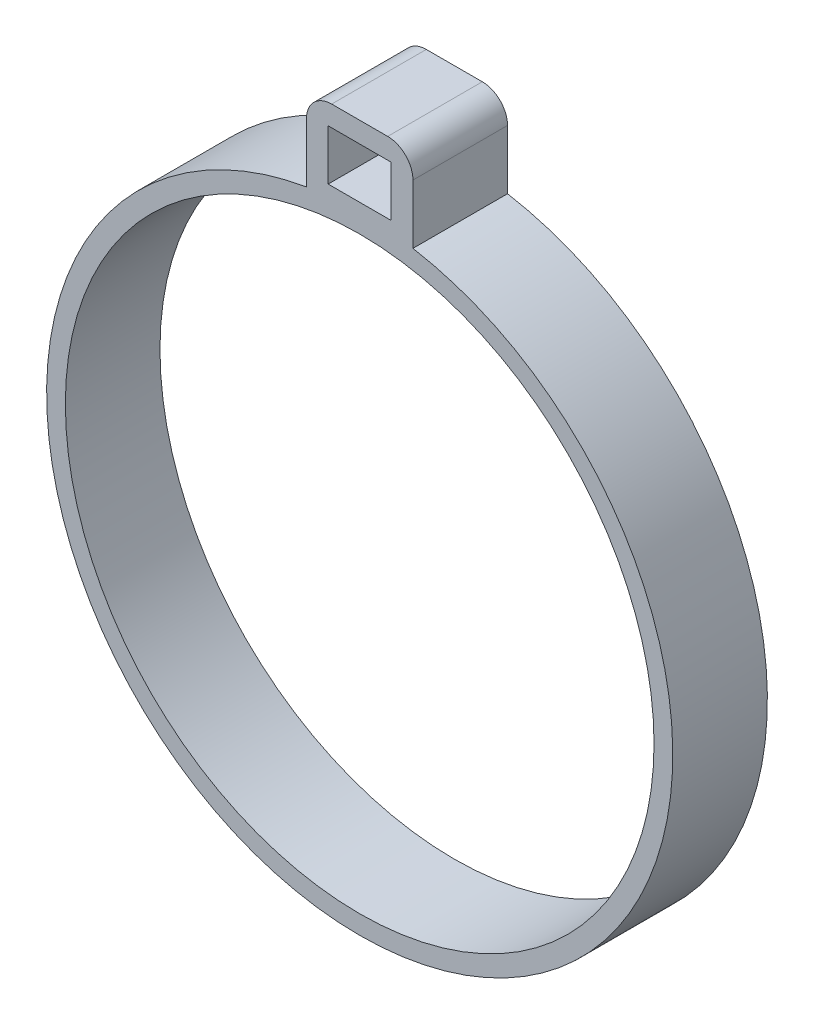
ISO-10303-21;
HEADER;
FILE_DESCRIPTION(('STEP AP214'),'2;1');
FILE_NAME('part.step','',(''),(''),'','','');
FILE_SCHEMA(('AUTOMOTIVE_DESIGN { 1 0 10303 214 1 1 1 1 }'));
ENDSEC;
DATA;
#1=APPLICATION_CONTEXT('core data for automotive mechanical design processes');
#2=APPLICATION_PROTOCOL_DEFINITION('international standard','automotive_design',2000,#1);
#3=PRODUCT_CONTEXT('',#1,'mechanical');
#4=PRODUCT('Part','Part','',(#3));
#5=PRODUCT_RELATED_PRODUCT_CATEGORY('part','',(#4));
#6=PRODUCT_DEFINITION_FORMATION('','',#4);
#7=PRODUCT_DEFINITION_CONTEXT('part definition',#1,'design');
#8=PRODUCT_DEFINITION('design','',#6,#7);
#9=PRODUCT_DEFINITION_SHAPE('','',#8);
#10=(LENGTH_UNIT() NAMED_UNIT(*) SI_UNIT(.MILLI.,.METRE.));
#11=(NAMED_UNIT(*) PLANE_ANGLE_UNIT() SI_UNIT($,.RADIAN.));
#12=(NAMED_UNIT(*) SI_UNIT($,.STERADIAN.) SOLID_ANGLE_UNIT());
#13=UNCERTAINTY_MEASURE_WITH_UNIT(LENGTH_MEASURE(1.E-05),#10,'distance_accuracy_value','');
#14=(GEOMETRIC_REPRESENTATION_CONTEXT(3) GLOBAL_UNCERTAINTY_ASSIGNED_CONTEXT((#13)) GLOBAL_UNIT_ASSIGNED_CONTEXT((#10,
#11,#12)) REPRESENTATION_CONTEXT('',''));
#15=CARTESIAN_POINT('',(0.,0.,0.));
#16=DIRECTION('',(0.,0.,1.));
#17=DIRECTION('',(1.,0.,0.));
#18=AXIS2_PLACEMENT_3D('',#15,#16,#17);
#19=CARTESIAN_POINT('',(0.,0.,7.5));
#20=DIRECTION('',(0.,0.,1.));
#21=DIRECTION('',(1.,0.,0.));
#22=AXIS2_PLACEMENT_3D('',#19,#20,#21);
#23=PLANE('',#22);
#24=DIRECTION('',(1.,0.,0.));
#25=VECTOR('',#24,1.);
#26=CARTESIAN_POINT('',(8.43970978087327,62.2911960228425,7.5));
#27=LINE('',#26,#25);
#28=CARTESIAN_POINT('',(-4.43970978087327,62.2911960228425,7.5));
#29=VERTEX_POINT('',#28);
#30=CARTESIAN_POINT('',(4.43970978087327,62.2911960228425,7.5));
#31=VERTEX_POINT('',#30);
#32=EDGE_CURVE('E155',#29,#31,#27,.T.);
#33=ORIENTED_EDGE('',*,*,#32,.F.);
#34=CARTESIAN_POINT('',(-4.43970978087327,58.2911960228425,7.5));
#35=DIRECTION('',(0.,0.,1.));
#36=DIRECTION('',(1.,0.,0.));
#37=AXIS2_PLACEMENT_3D('',#34,#35,#36);
#38=CIRCLE('',#37,4.);
#39=CARTESIAN_POINT('',(-8.43970978087327,58.2911960228425,7.5));
#40=VERTEX_POINT('',#39);
#41=EDGE_CURVE('E41',#29,#40,#38,.T.);
#42=ORIENTED_EDGE('',*,*,#41,.T.);
#43=DIRECTION('',(0.,1.,0.));
#44=VECTOR('',#43,1.);
#45=CARTESIAN_POINT('',(-8.43970978087327,62.2911960228425,7.5));
#46=LINE('',#45,#44);
#47=CARTESIAN_POINT('',(-8.43970978087327,48.9157528154891,7.5));
#48=VERTEX_POINT('',#47);
#49=EDGE_CURVE('E152',#48,#40,#46,.T.);
#50=ORIENTED_EDGE('',*,*,#49,.F.);
#51=CARTESIAN_POINT('',(0.,0.,7.5));
#52=DIRECTION('',(0.,0.,1.));
#53=DIRECTION('',(1.,0.,0.));
#54=AXIS2_PLACEMENT_3D('',#51,#52,#53);
#55=CIRCLE('',#54,49.6384888437531);
#56=CARTESIAN_POINT('',(8.43970978087327,48.9157528154891,7.5));
#57=VERTEX_POINT('',#56);
#58=EDGE_CURVE('E173',#48,#57,#55,.T.);
#59=ORIENTED_EDGE('',*,*,#58,.T.);
#60=DIRECTION('',(0.,-1.,0.));
#61=VECTOR('',#60,1.);
#62=CARTESIAN_POINT('',(8.43970978087327,62.2911960228425,7.5));
#63=LINE('',#62,#61);
#64=CARTESIAN_POINT('',(8.43970978087327,58.2911960228425,7.5));
#65=VERTEX_POINT('',#64);
#66=EDGE_CURVE('E158',#65,#57,#63,.T.);
#67=ORIENTED_EDGE('',*,*,#66,.F.);
#68=CARTESIAN_POINT('',(4.43970978087327,58.2911960228425,7.5));
#69=DIRECTION('',(0.,0.,1.));
#70=DIRECTION('',(1.,0.,0.));
#71=AXIS2_PLACEMENT_3D('',#68,#69,#70);
#72=CIRCLE('',#71,4.);
#73=EDGE_CURVE('E53',#65,#31,#72,.T.);
#74=ORIENTED_EDGE('',*,*,#73,.T.);
#75=EDGE_LOOP('',(#33,#42,#50,#59,#67,#74));
#76=FACE_BOUND('',#75,.T.);
#77=CARTESIAN_POINT('',(0.,0.,7.5));
#78=DIRECTION('',(0.,0.,1.));
#79=DIRECTION('',(1.,0.,0.));
#80=AXIS2_PLACEMENT_3D('',#77,#78,#79);
#81=CIRCLE('',#80,46.6676642181221);
#82=CARTESIAN_POINT('',(46.6676642181221,0.,7.5));
#83=VERTEX_POINT('',#82);
#84=EDGE_CURVE('E167',#83,#83,#81,.T.);
#85=ORIENTED_EDGE('',*,*,#84,.F.);
#86=EDGE_LOOP('',(#85));
#87=FACE_BOUND('',#86,.T.);
#88=DIRECTION('',(-1.,0.,0.));
#89=VECTOR('',#88,1.);
#90=CARTESIAN_POINT('',(5.,51.0246494821411,7.5));
#91=LINE('',#90,#89);
#92=CARTESIAN_POINT('',(5.,51.0246494821411,7.5));
#93=VERTEX_POINT('',#92);
#94=CARTESIAN_POINT('',(-5.,51.0246494821411,7.5));
#95=VERTEX_POINT('',#94);
#96=EDGE_CURVE('E122',#93,#95,#91,.T.);
#97=ORIENTED_EDGE('',*,*,#96,.T.);
#98=DIRECTION('',(0.,1.,0.));
#99=VECTOR('',#98,1.);
#100=CARTESIAN_POINT('',(-5.,59.0246494821411,7.5));
#101=LINE('',#100,#99);
#102=CARTESIAN_POINT('',(-5.,59.0246494821411,7.5));
#103=VERTEX_POINT('',#102);
#104=EDGE_CURVE('E114',#95,#103,#101,.T.);
#105=ORIENTED_EDGE('',*,*,#104,.T.);
#106=DIRECTION('',(1.,0.,0.));
#107=VECTOR('',#106,1.);
#108=CARTESIAN_POINT('',(5.,59.0246494821411,7.5));
#109=LINE('',#108,#107);
#110=CARTESIAN_POINT('',(5.,59.0246494821411,7.5));
#111=VERTEX_POINT('',#110);
#112=EDGE_CURVE('E126',#103,#111,#109,.T.);
#113=ORIENTED_EDGE('',*,*,#112,.T.);
#114=DIRECTION('',(0.,-1.,0.));
#115=VECTOR('',#114,1.);
#116=CARTESIAN_POINT('',(5.,59.0246494821411,7.5));
#117=LINE('',#116,#115);
#118=EDGE_CURVE('E130',#111,#93,#117,.T.);
#119=ORIENTED_EDGE('',*,*,#118,.T.);
#120=EDGE_LOOP('',(#97,#105,#113,#119));
#121=FACE_BOUND('',#120,.T.);
#122=ADVANCED_FACE('F33',(#76,#87,#121),#23,.T.);
#123=CARTESIAN_POINT('',(0.,0.,-7.5));
#124=DIRECTION('',(0.,0.,1.));
#125=DIRECTION('',(1.,0.,0.));
#126=AXIS2_PLACEMENT_3D('',#123,#124,#125);
#127=PLANE('',#126);
#128=DIRECTION('',(0.,1.,0.));
#129=VECTOR('',#128,1.);
#130=CARTESIAN_POINT('',(-8.43970978087327,62.2911960228425,-7.5));
#131=LINE('',#130,#129);
#132=CARTESIAN_POINT('',(-8.43970978087327,48.9157528154891,-7.5));
#133=VERTEX_POINT('',#132);
#134=CARTESIAN_POINT('',(-8.43970978087327,58.2911960228425,-7.5));
#135=VERTEX_POINT('',#134);
#136=EDGE_CURVE('E148',#133,#135,#131,.T.);
#137=ORIENTED_EDGE('',*,*,#136,.T.);
#138=CARTESIAN_POINT('',(-4.43970978087327,58.2911960228425,-7.5));
#139=DIRECTION('',(0.,0.,1.));
#140=DIRECTION('',(1.,0.,0.));
#141=AXIS2_PLACEMENT_3D('',#138,#139,#140);
#142=CIRCLE('',#141,4.);
#143=CARTESIAN_POINT('',(-4.43970978087327,62.2911960228425,-7.5));
#144=VERTEX_POINT('',#143);
#145=EDGE_CURVE('E189',#135,#144,#142,.F.);
#146=ORIENTED_EDGE('',*,*,#145,.T.);
#147=DIRECTION('',(1.,0.,0.));
#148=VECTOR('',#147,1.);
#149=CARTESIAN_POINT('',(8.43970978087327,62.2911960228425,-7.5));
#150=LINE('',#149,#148);
#151=CARTESIAN_POINT('',(4.43970978087327,62.2911960228425,-7.5));
#152=VERTEX_POINT('',#151);
#153=EDGE_CURVE('E163',#144,#152,#150,.T.);
#154=ORIENTED_EDGE('',*,*,#153,.T.);
#155=CARTESIAN_POINT('',(4.43970978087327,58.2911960228425,-7.5));
#156=DIRECTION('',(0.,0.,1.));
#157=DIRECTION('',(1.,0.,0.));
#158=AXIS2_PLACEMENT_3D('',#155,#156,#157);
#159=CIRCLE('',#158,4.);
#160=CARTESIAN_POINT('',(8.43970978087327,58.2911960228425,-7.5));
#161=VERTEX_POINT('',#160);
#162=EDGE_CURVE('E187',#152,#161,#159,.F.);
#163=ORIENTED_EDGE('',*,*,#162,.T.);
#164=DIRECTION('',(0.,-1.,0.));
#165=VECTOR('',#164,1.);
#166=CARTESIAN_POINT('',(8.43970978087327,62.2911960228425,-7.5));
#167=LINE('',#166,#165);
#168=CARTESIAN_POINT('',(8.43970978087327,48.9157528154891,-7.5));
#169=VERTEX_POINT('',#168);
#170=EDGE_CURVE('E156',#161,#169,#167,.T.);
#171=ORIENTED_EDGE('',*,*,#170,.T.);
#172=CARTESIAN_POINT('',(0.,0.,-7.5));
#173=DIRECTION('',(0.,0.,1.));
#174=DIRECTION('',(1.,0.,0.));
#175=AXIS2_PLACEMENT_3D('',#172,#173,#174);
#176=CIRCLE('',#175,49.6384888437531);
#177=EDGE_CURVE('E170',#133,#169,#176,.T.);
#178=ORIENTED_EDGE('',*,*,#177,.F.);
#179=EDGE_LOOP('',(#137,#146,#154,#163,#171,#178));
#180=FACE_BOUND('',#179,.T.);
#181=CARTESIAN_POINT('',(0.,0.,-7.5));
#182=DIRECTION('',(0.,0.,1.));
#183=DIRECTION('',(1.,0.,0.));
#184=AXIS2_PLACEMENT_3D('',#181,#182,#183);
#185=CIRCLE('',#184,46.6676642181221);
#186=CARTESIAN_POINT('',(46.6676642181221,0.,-7.5));
#187=VERTEX_POINT('',#186);
#188=EDGE_CURVE('E160',#187,#187,#185,.T.);
#189=ORIENTED_EDGE('',*,*,#188,.T.);
#190=EDGE_LOOP('',(#189));
#191=FACE_BOUND('',#190,.T.);
#192=DIRECTION('',(0.,1.,0.));
#193=VECTOR('',#192,1.);
#194=CARTESIAN_POINT('',(-5.,59.0246494821411,-7.5));
#195=LINE('',#194,#193);
#196=CARTESIAN_POINT('',(-5.,51.0246494821411,-7.5));
#197=VERTEX_POINT('',#196);
#198=CARTESIAN_POINT('',(-5.,59.0246494821411,-7.5));
#199=VERTEX_POINT('',#198);
#200=EDGE_CURVE('E117',#197,#199,#195,.T.);
#201=ORIENTED_EDGE('',*,*,#200,.F.);
#202=DIRECTION('',(-1.,0.,0.));
#203=VECTOR('',#202,1.);
#204=CARTESIAN_POINT('',(5.,51.0246494821411,-7.5));
#205=LINE('',#204,#203);
#206=CARTESIAN_POINT('',(5.,51.0246494821411,-7.5));
#207=VERTEX_POINT('',#206);
#208=EDGE_CURVE('E133',#207,#197,#205,.T.);
#209=ORIENTED_EDGE('',*,*,#208,.F.);
#210=DIRECTION('',(0.,-1.,0.));
#211=VECTOR('',#210,1.);
#212=CARTESIAN_POINT('',(5.,59.0246494821411,-7.5));
#213=LINE('',#212,#211);
#214=CARTESIAN_POINT('',(5.,59.0246494821411,-7.5));
#215=VERTEX_POINT('',#214);
#216=EDGE_CURVE('E136',#215,#207,#213,.T.);
#217=ORIENTED_EDGE('',*,*,#216,.F.);
#218=DIRECTION('',(1.,0.,0.));
#219=VECTOR('',#218,1.);
#220=CARTESIAN_POINT('',(5.,59.0246494821411,-7.5));
#221=LINE('',#220,#219);
#222=EDGE_CURVE('E142',#199,#215,#221,.T.);
#223=ORIENTED_EDGE('',*,*,#222,.F.);
#224=EDGE_LOOP('',(#201,#209,#217,#223));
#225=FACE_BOUND('',#224,.T.);
#226=ADVANCED_FACE('F209',(#180,#191,#225),#127,.F.);
#227=CARTESIAN_POINT('',(0.,0.,7.5));
#228=DIRECTION('',(0.,0.,-1.));
#229=DIRECTION('',(-1.,0.,0.));
#230=AXIS2_PLACEMENT_3D('',#227,#228,#229);
#231=CYLINDRICAL_SURFACE('',#230,49.6384888437531);
#232=ORIENTED_EDGE('',*,*,#58,.F.);
#233=DIRECTION('',(0.,0.,-1.));
#234=VECTOR('',#233,1.);
#235=CARTESIAN_POINT('',(-8.43970978087327,48.9157528154891,7.5));
#236=LINE('',#235,#234);
#237=EDGE_CURVE('E181',#48,#133,#236,.T.);
#238=ORIENTED_EDGE('',*,*,#237,.T.);
#239=ORIENTED_EDGE('',*,*,#177,.T.);
#240=DIRECTION('',(0.,0.,-1.));
#241=VECTOR('',#240,1.);
#242=CARTESIAN_POINT('',(8.43970978087327,48.9157528154891,7.5));
#243=LINE('',#242,#241);
#244=EDGE_CURVE('E176',#169,#57,#243,.F.);
#245=ORIENTED_EDGE('',*,*,#244,.T.);
#246=EDGE_LOOP('',(#232,#238,#239,#245));
#247=FACE_BOUND('',#246,.T.);
#248=ADVANCED_FACE('F218',(#247),#231,.T.);
#249=CARTESIAN_POINT('',(0.,0.,7.5));
#250=DIRECTION('',(0.,0.,-1.));
#251=DIRECTION('',(-1.,0.,0.));
#252=AXIS2_PLACEMENT_3D('',#249,#250,#251);
#253=CYLINDRICAL_SURFACE('',#252,46.6676642181221);
#254=ORIENTED_EDGE('',*,*,#84,.T.);
#255=EDGE_LOOP('',(#254));
#256=FACE_BOUND('',#255,.T.);
#257=ORIENTED_EDGE('',*,*,#188,.F.);
#258=EDGE_LOOP('',(#257));
#259=FACE_BOUND('',#258,.T.);
#260=ADVANCED_FACE('F220',(#256,#259),#253,.F.);
#261=CARTESIAN_POINT('',(-8.43970978087327,62.2911960228425,7.5));
#262=DIRECTION('',(-1.,0.,0.));
#263=DIRECTION('',(0.,0.,1.));
#264=AXIS2_PLACEMENT_3D('',#261,#262,#263);
#265=PLANE('',#264);
#266=ORIENTED_EDGE('',*,*,#49,.T.);
#267=DIRECTION('',(0.,0.,-1.));
#268=VECTOR('',#267,1.);
#269=CARTESIAN_POINT('',(-8.43970978087327,58.2911960228425,7.5));
#270=LINE('',#269,#268);
#271=EDGE_CURVE('E184',#40,#135,#270,.T.);
#272=ORIENTED_EDGE('',*,*,#271,.T.);
#273=ORIENTED_EDGE('',*,*,#136,.F.);
#274=ORIENTED_EDGE('',*,*,#237,.F.);
#275=EDGE_LOOP('',(#266,#272,#273,#274));
#276=FACE_BOUND('',#275,.T.);
#277=ADVANCED_FACE('F204',(#276),#265,.T.);
#278=CARTESIAN_POINT('',(8.43970978087327,62.2911960228425,7.5));
#279=DIRECTION('',(1.,0.,0.));
#280=DIRECTION('',(0.,0.,-1.));
#281=AXIS2_PLACEMENT_3D('',#278,#279,#280);
#282=PLANE('',#281);
#283=ORIENTED_EDGE('',*,*,#170,.F.);
#284=DIRECTION('',(0.,0.,-1.));
#285=VECTOR('',#284,1.);
#286=CARTESIAN_POINT('',(8.43970978087327,58.2911960228425,7.5));
#287=LINE('',#286,#285);
#288=EDGE_CURVE('E11',#161,#65,#287,.F.);
#289=ORIENTED_EDGE('',*,*,#288,.T.);
#290=ORIENTED_EDGE('',*,*,#66,.T.);
#291=ORIENTED_EDGE('',*,*,#244,.F.);
#292=EDGE_LOOP('',(#283,#289,#290,#291));
#293=FACE_BOUND('',#292,.T.);
#294=ADVANCED_FACE('F216',(#293),#282,.T.);
#295=CARTESIAN_POINT('',(8.43970978087327,62.2911960228425,7.5));
#296=DIRECTION('',(0.,1.,0.));
#297=DIRECTION('',(0.,0.,1.));
#298=AXIS2_PLACEMENT_3D('',#295,#296,#297);
#299=PLANE('',#298);
#300=ORIENTED_EDGE('',*,*,#153,.F.);
#301=DIRECTION('',(0.,0.,-1.));
#302=VECTOR('',#301,1.);
#303=CARTESIAN_POINT('',(-4.43970978087327,62.2911960228425,7.5));
#304=LINE('',#303,#302);
#305=EDGE_CURVE('E194',#144,#29,#304,.F.);
#306=ORIENTED_EDGE('',*,*,#305,.T.);
#307=ORIENTED_EDGE('',*,*,#32,.T.);
#308=DIRECTION('',(0.,0.,-1.));
#309=VECTOR('',#308,1.);
#310=CARTESIAN_POINT('',(4.43970978087327,62.2911960228425,7.5));
#311=LINE('',#310,#309);
#312=EDGE_CURVE('E191',#31,#152,#311,.T.);
#313=ORIENTED_EDGE('',*,*,#312,.T.);
#314=EDGE_LOOP('',(#300,#306,#307,#313));
#315=FACE_BOUND('',#314,.T.);
#316=ADVANCED_FACE('F212',(#315),#299,.T.);
#317=CARTESIAN_POINT('',(-5.,59.0246494821411,7.5));
#318=DIRECTION('',(-1.,0.,0.));
#319=DIRECTION('',(0.,-1.,0.));
#320=AXIS2_PLACEMENT_3D('',#317,#318,#319);
#321=PLANE('',#320);
#322=ORIENTED_EDGE('',*,*,#200,.T.);
#323=DIRECTION('',(0.,0.,-1.));
#324=VECTOR('',#323,1.);
#325=CARTESIAN_POINT('',(-5.,59.0246494821411,7.5));
#326=LINE('',#325,#324);
#327=EDGE_CURVE('E110',#103,#199,#326,.T.);
#328=ORIENTED_EDGE('',*,*,#327,.F.);
#329=ORIENTED_EDGE('',*,*,#104,.F.);
#330=DIRECTION('',(0.,0.,-1.));
#331=VECTOR('',#330,1.);
#332=CARTESIAN_POINT('',(-5.,51.0246494821411,7.5));
#333=LINE('',#332,#331);
#334=EDGE_CURVE('E146',#95,#197,#333,.T.);
#335=ORIENTED_EDGE('',*,*,#334,.T.);
#336=EDGE_LOOP('',(#322,#328,#329,#335));
#337=FACE_BOUND('',#336,.T.);
#338=ADVANCED_FACE('F112',(#337),#321,.F.);
#339=CARTESIAN_POINT('',(5.,51.0246494821411,7.5));
#340=DIRECTION('',(0.,-1.,0.));
#341=DIRECTION('',(0.,0.,-1.));
#342=AXIS2_PLACEMENT_3D('',#339,#340,#341);
#343=PLANE('',#342);
#344=ORIENTED_EDGE('',*,*,#208,.T.);
#345=ORIENTED_EDGE('',*,*,#334,.F.);
#346=ORIENTED_EDGE('',*,*,#96,.F.);
#347=DIRECTION('',(0.,0.,-1.));
#348=VECTOR('',#347,1.);
#349=CARTESIAN_POINT('',(5.,51.0246494821411,7.5));
#350=LINE('',#349,#348);
#351=EDGE_CURVE('E149',#93,#207,#350,.T.);
#352=ORIENTED_EDGE('',*,*,#351,.T.);
#353=EDGE_LOOP('',(#344,#345,#346,#352));
#354=FACE_BOUND('',#353,.T.);
#355=ADVANCED_FACE('F242',(#354),#343,.F.);
#356=CARTESIAN_POINT('',(5.,59.0246494821411,7.5));
#357=DIRECTION('',(1.,0.,0.));
#358=DIRECTION('',(0.,1.,0.));
#359=AXIS2_PLACEMENT_3D('',#356,#357,#358);
#360=PLANE('',#359);
#361=ORIENTED_EDGE('',*,*,#216,.T.);
#362=ORIENTED_EDGE('',*,*,#351,.F.);
#363=ORIENTED_EDGE('',*,*,#118,.F.);
#364=DIRECTION('',(0.,0.,-1.));
#365=VECTOR('',#364,1.);
#366=CARTESIAN_POINT('',(5.,59.0246494821411,7.5));
#367=LINE('',#366,#365);
#368=EDGE_CURVE('E121',#111,#215,#367,.T.);
#369=ORIENTED_EDGE('',*,*,#368,.T.);
#370=EDGE_LOOP('',(#361,#362,#363,#369));
#371=FACE_BOUND('',#370,.T.);
#372=ADVANCED_FACE('F245',(#371),#360,.F.);
#373=CARTESIAN_POINT('',(5.,59.0246494821411,7.5));
#374=DIRECTION('',(0.,1.,0.));
#375=DIRECTION('',(0.,0.,1.));
#376=AXIS2_PLACEMENT_3D('',#373,#374,#375);
#377=PLANE('',#376);
#378=ORIENTED_EDGE('',*,*,#222,.T.);
#379=ORIENTED_EDGE('',*,*,#368,.F.);
#380=ORIENTED_EDGE('',*,*,#112,.F.);
#381=ORIENTED_EDGE('',*,*,#327,.T.);
#382=EDGE_LOOP('',(#378,#379,#380,#381));
#383=FACE_BOUND('',#382,.T.);
#384=ADVANCED_FACE('F127',(#383),#377,.F.);
#385=CARTESIAN_POINT('',(-4.43970978087327,58.2911960228425,7.5));
#386=DIRECTION('',(0.,0.,-1.));
#387=DIRECTION('',(-1.,0.,0.));
#388=AXIS2_PLACEMENT_3D('',#385,#386,#387);
#389=CYLINDRICAL_SURFACE('',#388,4.);
#390=ORIENTED_EDGE('',*,*,#41,.F.);
#391=ORIENTED_EDGE('',*,*,#305,.F.);
#392=ORIENTED_EDGE('',*,*,#145,.F.);
#393=ORIENTED_EDGE('',*,*,#271,.F.);
#394=EDGE_LOOP('',(#390,#391,#392,#393));
#395=FACE_BOUND('',#394,.T.);
#396=ADVANCED_FACE('F206',(#395),#389,.T.);
#397=CARTESIAN_POINT('',(4.43970978087327,58.2911960228425,7.5));
#398=DIRECTION('',(0.,0.,-1.));
#399=DIRECTION('',(-1.,0.,0.));
#400=AXIS2_PLACEMENT_3D('',#397,#398,#399);
#401=CYLINDRICAL_SURFACE('',#400,4.);
#402=ORIENTED_EDGE('',*,*,#73,.F.);
#403=ORIENTED_EDGE('',*,*,#288,.F.);
#404=ORIENTED_EDGE('',*,*,#162,.F.);
#405=ORIENTED_EDGE('',*,*,#312,.F.);
#406=EDGE_LOOP('',(#402,#403,#404,#405));
#407=FACE_BOUND('',#406,.T.);
#408=ADVANCED_FACE('F35',(#407),#401,.T.);
#409=CLOSED_SHELL('',(#122,#226,#248,#260,#277,#294,#316,#338,#355,#372,#384,#396,#408));
#410=MANIFOLD_SOLID_BREP('B2',#409);
#411=ADVANCED_BREP_SHAPE_REPRESENTATION('',(#18,#410),#14);
#412=SHAPE_DEFINITION_REPRESENTATION(#9,#411);
ENDSEC;
END-ISO-10303-21;
